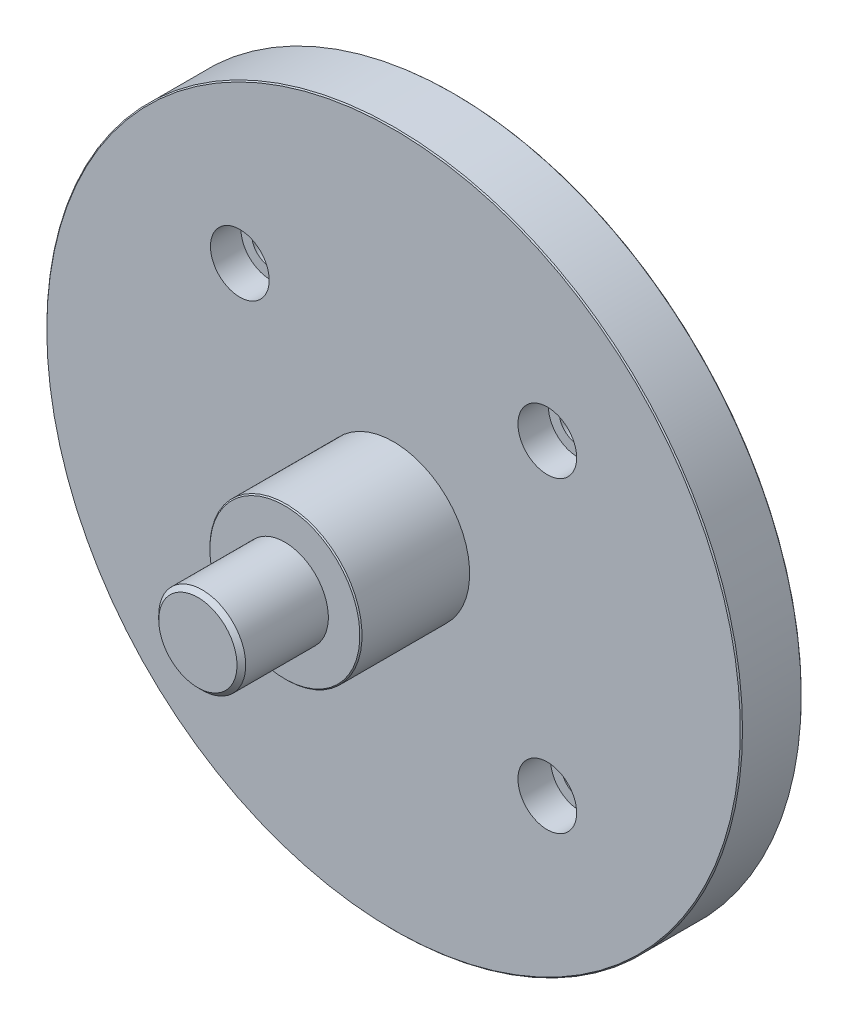
ISO-10303-21;
HEADER;
FILE_DESCRIPTION(('STEP AP214'),'2;1');
FILE_NAME('part.step','',(''),(''),'','','');
FILE_SCHEMA(('AUTOMOTIVE_DESIGN { 1 0 10303 214 1 1 1 1 }'));
ENDSEC;
DATA;
#1=APPLICATION_CONTEXT('core data for automotive mechanical design processes');
#2=APPLICATION_PROTOCOL_DEFINITION('international standard','automotive_design',2000,#1);
#3=PRODUCT_CONTEXT('',#1,'mechanical');
#4=PRODUCT('Part','Part','',(#3));
#5=PRODUCT_RELATED_PRODUCT_CATEGORY('part','',(#4));
#6=PRODUCT_DEFINITION_FORMATION('','',#4);
#7=PRODUCT_DEFINITION_CONTEXT('part definition',#1,'design');
#8=PRODUCT_DEFINITION('design','',#6,#7);
#9=PRODUCT_DEFINITION_SHAPE('','',#8);
#10=(LENGTH_UNIT() NAMED_UNIT(*) SI_UNIT(.MILLI.,.METRE.));
#11=(NAMED_UNIT(*) PLANE_ANGLE_UNIT() SI_UNIT($,.RADIAN.));
#12=(NAMED_UNIT(*) SI_UNIT($,.STERADIAN.) SOLID_ANGLE_UNIT());
#13=UNCERTAINTY_MEASURE_WITH_UNIT(LENGTH_MEASURE(1.E-05),#10,'distance_accuracy_value','');
#14=(GEOMETRIC_REPRESENTATION_CONTEXT(3) GLOBAL_UNCERTAINTY_ASSIGNED_CONTEXT((#13)) GLOBAL_UNIT_ASSIGNED_CONTEXT((#10,
#11,#12)) REPRESENTATION_CONTEXT('',''));
#15=CARTESIAN_POINT('',(0.,0.,0.));
#16=DIRECTION('',(0.,0.,1.));
#17=DIRECTION('',(1.,0.,0.));
#18=AXIS2_PLACEMENT_3D('',#15,#16,#17);
#19=CARTESIAN_POINT('',(-196.682719320138,-420.602297752566,-777.986147986319));
#20=DIRECTION('',(0.,0.,1.));
#21=DIRECTION('',(1.,0.,0.));
#22=AXIS2_PLACEMENT_3D('',#19,#20,#21);
#23=PLANE('',#22);
#24=CARTESIAN_POINT('',(-196.682719320138,-420.602297752566,-777.986147986319));
#25=DIRECTION('',(0.,0.,-1.));
#26=DIRECTION('',(-1.,0.,0.));
#27=AXIS2_PLACEMENT_3D('',#24,#25,#26);
#28=CIRCLE('',#27,9.00000000000001);
#29=CARTESIAN_POINT('',(-205.682719320138,-420.602297752566,-777.986147986319));
#30=VERTEX_POINT('',#29);
#31=EDGE_CURVE('E18',#30,#30,#28,.T.);
#32=ORIENTED_EDGE('',*,*,#31,.F.);
#33=EDGE_LOOP('',(#32));
#34=FACE_BOUND('',#33,.T.);
#35=ADVANCED_FACE('F15',(#34),#23,.T.);
#36=CARTESIAN_POINT('',(-196.682719320138,-420.602297752566,-778.986147986319));
#37=DIRECTION('',(0.,0.,-1.));
#38=DIRECTION('',(-1.,0.,0.));
#39=AXIS2_PLACEMENT_3D('',#36,#37,#38);
#40=CONICAL_SURFACE('',#39,10.,0.785398163397448);
#41=CARTESIAN_POINT('',(-196.682719320138,-420.602297752566,-778.986147986319));
#42=DIRECTION('',(0.,0.,-1.));
#43=DIRECTION('',(-1.,0.,0.));
#44=AXIS2_PLACEMENT_3D('',#41,#42,#43);
#45=CIRCLE('',#44,10.);
#46=CARTESIAN_POINT('',(-206.682719320138,-420.602297752566,-778.986147986319));
#47=VERTEX_POINT('',#46);
#48=EDGE_CURVE('E30',#47,#47,#45,.T.);
#49=ORIENTED_EDGE('',*,*,#48,.F.);
#50=EDGE_LOOP('',(#49));
#51=FACE_BOUND('',#50,.T.);
#52=ORIENTED_EDGE('',*,*,#31,.T.);
#53=EDGE_LOOP('',(#52));
#54=FACE_BOUND('',#53,.T.);
#55=ADVANCED_FACE('F105',(#51,#54),#40,.T.);
#56=CARTESIAN_POINT('',(-196.682719320138,-420.602297752566,-777.986147986319));
#57=DIRECTION('',(0.,0.,-1.));
#58=DIRECTION('',(-1.,0.,0.));
#59=AXIS2_PLACEMENT_3D('',#56,#57,#58);
#60=CYLINDRICAL_SURFACE('',#59,10.);
#61=ORIENTED_EDGE('',*,*,#48,.T.);
#62=EDGE_LOOP('',(#61));
#63=FACE_BOUND('',#62,.T.);
#64=CARTESIAN_POINT('',(-196.682719320138,-420.602297752566,-797.986147986318));
#65=DIRECTION('',(0.,0.,-1.));
#66=DIRECTION('',(-1.,0.,0.));
#67=AXIS2_PLACEMENT_3D('',#64,#65,#66);
#68=CIRCLE('',#67,10.);
#69=CARTESIAN_POINT('',(-206.682719320138,-420.602297752566,-797.986147986318));
#70=VERTEX_POINT('',#69);
#71=EDGE_CURVE('E95',#70,#70,#68,.T.);
#72=ORIENTED_EDGE('',*,*,#71,.F.);
#73=EDGE_LOOP('',(#72));
#74=FACE_BOUND('',#73,.T.);
#75=ADVANCED_FACE('F112',(#63,#74),#60,.T.);
#76=CARTESIAN_POINT('',(-196.682719320137,-420.602297752566,-797.986147986318));
#77=DIRECTION('',(0.,0.,1.));
#78=DIRECTION('',(1.,0.,0.));
#79=AXIS2_PLACEMENT_3D('',#76,#77,#78);
#80=PLANE('',#79);
#81=ORIENTED_EDGE('',*,*,#71,.T.);
#82=EDGE_LOOP('',(#81));
#83=FACE_BOUND('',#82,.T.);
#84=CARTESIAN_POINT('',(-196.682719320137,-420.602297752566,-797.986147986318));
#85=DIRECTION('',(0.,0.,-1.));
#86=DIRECTION('',(-1.,0.,0.));
#87=AXIS2_PLACEMENT_3D('',#84,#85,#86);
#88=CIRCLE('',#87,17.25);
#89=CARTESIAN_POINT('',(-213.932719320137,-420.602297752566,-797.986147986318));
#90=VERTEX_POINT('',#89);
#91=EDGE_CURVE('E93',#90,#90,#88,.T.);
#92=ORIENTED_EDGE('',*,*,#91,.F.);
#93=EDGE_LOOP('',(#92));
#94=FACE_BOUND('',#93,.T.);
#95=ADVANCED_FACE('F204',(#83,#94),#80,.T.);
#96=CARTESIAN_POINT('',(-196.682719320137,-420.602297752566,-798.236147986318));
#97=DIRECTION('',(0.,0.,-1.));
#98=DIRECTION('',(-1.,0.,0.));
#99=AXIS2_PLACEMENT_3D('',#96,#97,#98);
#100=CONICAL_SURFACE('',#99,17.5000000000005,0.785398163397448);
#101=ORIENTED_EDGE('',*,*,#91,.T.);
#102=EDGE_LOOP('',(#101));
#103=FACE_BOUND('',#102,.T.);
#104=CARTESIAN_POINT('',(-196.682719320137,-420.602297752566,-798.236147986318));
#105=DIRECTION('',(0.,0.,-1.));
#106=DIRECTION('',(-1.,0.,0.));
#107=AXIS2_PLACEMENT_3D('',#104,#105,#106);
#108=CIRCLE('',#107,17.5);
#109=CARTESIAN_POINT('',(-214.182719320137,-420.602297752566,-798.236147986318));
#110=VERTEX_POINT('',#109);
#111=EDGE_CURVE('E92',#110,#110,#108,.T.);
#112=ORIENTED_EDGE('',*,*,#111,.F.);
#113=EDGE_LOOP('',(#112));
#114=FACE_BOUND('',#113,.T.);
#115=ADVANCED_FACE('F200',(#103,#114),#100,.T.);
#116=CARTESIAN_POINT('',(-196.682719320137,-420.602297752566,-797.986147986318));
#117=DIRECTION('',(0.,0.,-1.));
#118=DIRECTION('',(-1.,0.,0.));
#119=AXIS2_PLACEMENT_3D('',#116,#117,#118);
#120=CYLINDRICAL_SURFACE('',#119,17.5);
#121=CARTESIAN_POINT('',(-196.682719320137,-420.602297752566,-822.98614798632));
#122=DIRECTION('',(0.,0.,-1.));
#123=DIRECTION('',(-1.,0.,0.));
#124=AXIS2_PLACEMENT_3D('',#121,#122,#123);
#125=CIRCLE('',#124,17.5);
#126=CARTESIAN_POINT('',(-214.182719320137,-420.602297752566,-822.98614798632));
#127=VERTEX_POINT('',#126);
#128=EDGE_CURVE('E89',#127,#127,#125,.T.);
#129=ORIENTED_EDGE('',*,*,#128,.F.);
#130=EDGE_LOOP('',(#129));
#131=FACE_BOUND('',#130,.T.);
#132=ORIENTED_EDGE('',*,*,#111,.T.);
#133=EDGE_LOOP('',(#132));
#134=FACE_BOUND('',#133,.T.);
#135=ADVANCED_FACE('F196',(#131,#134),#120,.T.);
#136=CARTESIAN_POINT('',(-196.682719320137,-420.602297752566,-822.98614798632));
#137=DIRECTION('',(0.,0.,1.));
#138=DIRECTION('',(1.,0.,0.));
#139=AXIS2_PLACEMENT_3D('',#136,#137,#138);
#140=PLANE('',#139);
#141=ORIENTED_EDGE('',*,*,#128,.T.);
#142=EDGE_LOOP('',(#141));
#143=FACE_BOUND('',#142,.T.);
#144=CARTESIAN_POINT('',(-232.037987668784,-455.957566101215,-822.98614798632));
#145=DIRECTION('',(0.,0.,-1.));
#146=DIRECTION('',(-1.,0.,0.));
#147=AXIS2_PLACEMENT_3D('',#144,#145,#146);
#148=CIRCLE('',#147,6.75);
#149=CARTESIAN_POINT('',(-238.787987668784,-455.957566101215,-822.98614798632));
#150=VERTEX_POINT('',#149);
#151=EDGE_CURVE('E74',#150,#150,#148,.T.);
#152=ORIENTED_EDGE('',*,*,#151,.T.);
#153=EDGE_LOOP('',(#152));
#154=FACE_BOUND('',#153,.T.);
#155=CARTESIAN_POINT('',(-161.327450971485,-455.957566101213,-822.98614798632));
#156=DIRECTION('',(0.,0.,-1.));
#157=DIRECTION('',(-1.,0.,0.));
#158=AXIS2_PLACEMENT_3D('',#155,#156,#157);
#159=CIRCLE('',#158,6.75);
#160=CARTESIAN_POINT('',(-168.077450971485,-455.957566101213,-822.98614798632));
#161=VERTEX_POINT('',#160);
#162=EDGE_CURVE('E77',#161,#161,#159,.T.);
#163=ORIENTED_EDGE('',*,*,#162,.T.);
#164=EDGE_LOOP('',(#163));
#165=FACE_BOUND('',#164,.T.);
#166=CARTESIAN_POINT('',(-161.327450971485,-385.247029403915,-822.98614798632));
#167=DIRECTION('',(0.,0.,-1.));
#168=DIRECTION('',(-1.,0.,0.));
#169=AXIS2_PLACEMENT_3D('',#166,#167,#168);
#170=CIRCLE('',#169,6.75);
#171=CARTESIAN_POINT('',(-168.077450971485,-385.247029403915,-822.98614798632));
#172=VERTEX_POINT('',#171);
#173=EDGE_CURVE('E80',#172,#172,#170,.T.);
#174=ORIENTED_EDGE('',*,*,#173,.T.);
#175=EDGE_LOOP('',(#174));
#176=FACE_BOUND('',#175,.T.);
#177=CARTESIAN_POINT('',(-232.037987668783,-385.247029403918,-822.98614798632));
#178=DIRECTION('',(0.,0.,-1.));
#179=DIRECTION('',(-1.,0.,0.));
#180=AXIS2_PLACEMENT_3D('',#177,#178,#179);
#181=CIRCLE('',#180,6.75);
#182=CARTESIAN_POINT('',(-238.787987668783,-385.247029403918,-822.98614798632));
#183=VERTEX_POINT('',#182);
#184=EDGE_CURVE('E83',#183,#183,#181,.T.);
#185=ORIENTED_EDGE('',*,*,#184,.T.);
#186=EDGE_LOOP('',(#185));
#187=FACE_BOUND('',#186,.T.);
#188=CARTESIAN_POINT('',(-196.682719320137,-420.602297752566,-822.986147986319));
#189=DIRECTION('',(0.,0.,-1.));
#190=DIRECTION('',(-1.,0.,0.));
#191=AXIS2_PLACEMENT_3D('',#188,#189,#190);
#192=CIRCLE('',#191,79.7500000000001);
#193=CARTESIAN_POINT('',(-276.432719320137,-420.602297752566,-822.986147986319));
#194=VERTEX_POINT('',#193);
#195=EDGE_CURVE('E86',#194,#194,#192,.T.);
#196=ORIENTED_EDGE('',*,*,#195,.F.);
#197=EDGE_LOOP('',(#196));
#198=FACE_BOUND('',#197,.T.);
#199=ADVANCED_FACE('F192',(#143,#154,#165,#176,#187,#198),#140,.T.);
#200=CARTESIAN_POINT('',(-196.682719320137,-420.602297752566,-823.236147986319));
#201=DIRECTION('',(0.,0.,-1.));
#202=DIRECTION('',(-1.,0.,0.));
#203=AXIS2_PLACEMENT_3D('',#200,#201,#202);
#204=CONICAL_SURFACE('',#203,79.9999999999996,0.785398163397448);
#205=ORIENTED_EDGE('',*,*,#195,.T.);
#206=EDGE_LOOP('',(#205));
#207=FACE_BOUND('',#206,.T.);
#208=CARTESIAN_POINT('',(-196.682719320137,-420.602297752566,-823.236147986319));
#209=DIRECTION('',(0.,0.,1.));
#210=DIRECTION('',(1.,0.,0.));
#211=AXIS2_PLACEMENT_3D('',#208,#209,#210);
#212=CIRCLE('',#211,80.);
#213=CARTESIAN_POINT('',(-116.682719320137,-420.602297752566,-823.236147986319));
#214=VERTEX_POINT('',#213);
#215=EDGE_CURVE('E73',#214,#214,#212,.F.);
#216=ORIENTED_EDGE('',*,*,#215,.F.);
#217=EDGE_LOOP('',(#216));
#218=FACE_BOUND('',#217,.T.);
#219=ADVANCED_FACE('F188',(#207,#218),#204,.T.);
#220=CARTESIAN_POINT('',(-232.037987668783,-385.247029403918,-826.486147986318));
#221=DIRECTION('',(0.,0.,-1.));
#222=DIRECTION('',(-1.,0.,0.));
#223=AXIS2_PLACEMENT_3D('',#220,#221,#222);
#224=CYLINDRICAL_SURFACE('',#223,6.75);
#225=ORIENTED_EDGE('',*,*,#184,.F.);
#226=EDGE_LOOP('',(#225));
#227=FACE_BOUND('',#226,.T.);
#228=CARTESIAN_POINT('',(-232.037987668783,-385.247029403918,-829.98614798632));
#229=DIRECTION('',(0.,0.,-1.));
#230=DIRECTION('',(-1.,0.,0.));
#231=AXIS2_PLACEMENT_3D('',#228,#229,#230);
#232=CIRCLE('',#231,6.75);
#233=CARTESIAN_POINT('',(-238.787987668783,-385.247029403918,-829.98614798632));
#234=VERTEX_POINT('',#233);
#235=EDGE_CURVE('E70',#234,#234,#232,.T.);
#236=ORIENTED_EDGE('',*,*,#235,.T.);
#237=EDGE_LOOP('',(#236));
#238=FACE_BOUND('',#237,.T.);
#239=ADVANCED_FACE('F184',(#227,#238),#224,.F.);
#240=CARTESIAN_POINT('',(-161.327450971485,-385.247029403915,-826.486147986318));
#241=DIRECTION('',(0.,0.,-1.));
#242=DIRECTION('',(-1.,0.,0.));
#243=AXIS2_PLACEMENT_3D('',#240,#241,#242);
#244=CYLINDRICAL_SURFACE('',#243,6.75);
#245=ORIENTED_EDGE('',*,*,#173,.F.);
#246=EDGE_LOOP('',(#245));
#247=FACE_BOUND('',#246,.T.);
#248=CARTESIAN_POINT('',(-161.327450971485,-385.247029403915,-829.98614798632));
#249=DIRECTION('',(0.,0.,-1.));
#250=DIRECTION('',(-1.,0.,0.));
#251=AXIS2_PLACEMENT_3D('',#248,#249,#250);
#252=CIRCLE('',#251,6.75);
#253=CARTESIAN_POINT('',(-168.077450971485,-385.247029403915,-829.98614798632));
#254=VERTEX_POINT('',#253);
#255=EDGE_CURVE('E67',#254,#254,#252,.T.);
#256=ORIENTED_EDGE('',*,*,#255,.T.);
#257=EDGE_LOOP('',(#256));
#258=FACE_BOUND('',#257,.T.);
#259=ADVANCED_FACE('F180',(#247,#258),#244,.F.);
#260=CARTESIAN_POINT('',(-161.327450971485,-455.957566101213,-826.73614798632));
#261=DIRECTION('',(0.,0.,-1.));
#262=DIRECTION('',(-1.,0.,0.));
#263=AXIS2_PLACEMENT_3D('',#260,#261,#262);
#264=CYLINDRICAL_SURFACE('',#263,6.75);
#265=ORIENTED_EDGE('',*,*,#162,.F.);
#266=EDGE_LOOP('',(#265));
#267=FACE_BOUND('',#266,.T.);
#268=CARTESIAN_POINT('',(-161.327450971485,-455.957566101213,-830.486147986317));
#269=DIRECTION('',(0.,0.,-1.));
#270=DIRECTION('',(-1.,0.,0.));
#271=AXIS2_PLACEMENT_3D('',#268,#269,#270);
#272=CIRCLE('',#271,6.75);
#273=CARTESIAN_POINT('',(-168.077450971485,-455.957566101213,-830.486147986317));
#274=VERTEX_POINT('',#273);
#275=EDGE_CURVE('E64',#274,#274,#272,.T.);
#276=ORIENTED_EDGE('',*,*,#275,.T.);
#277=EDGE_LOOP('',(#276));
#278=FACE_BOUND('',#277,.T.);
#279=ADVANCED_FACE('F176',(#267,#278),#264,.F.);
#280=CARTESIAN_POINT('',(-232.037987668784,-455.957566101215,-826.486147986318));
#281=DIRECTION('',(0.,0.,-1.));
#282=DIRECTION('',(-1.,0.,0.));
#283=AXIS2_PLACEMENT_3D('',#280,#281,#282);
#284=CYLINDRICAL_SURFACE('',#283,6.75);
#285=ORIENTED_EDGE('',*,*,#151,.F.);
#286=EDGE_LOOP('',(#285));
#287=FACE_BOUND('',#286,.T.);
#288=CARTESIAN_POINT('',(-232.037987668784,-455.957566101215,-829.98614798632));
#289=DIRECTION('',(0.,0.,-1.));
#290=DIRECTION('',(-1.,0.,0.));
#291=AXIS2_PLACEMENT_3D('',#288,#289,#290);
#292=CIRCLE('',#291,6.75);
#293=CARTESIAN_POINT('',(-238.787987668784,-455.957566101215,-829.98614798632));
#294=VERTEX_POINT('',#293);
#295=EDGE_CURVE('E61',#294,#294,#292,.T.);
#296=ORIENTED_EDGE('',*,*,#295,.T.);
#297=EDGE_LOOP('',(#296));
#298=FACE_BOUND('',#297,.T.);
#299=ADVANCED_FACE('F172',(#287,#298),#284,.F.);
#300=CARTESIAN_POINT('',(-196.682719320137,-420.602297752566,-856.986147986318));
#301=DIRECTION('',(0.,0.,-1.));
#302=DIRECTION('',(-1.,0.,0.));
#303=AXIS2_PLACEMENT_3D('',#300,#301,#302);
#304=PLANE('',#303);
#305=CARTESIAN_POINT('',(-196.682719320137,-420.602297752566,-856.986147986318));
#306=DIRECTION('',(0.,0.,1.));
#307=DIRECTION('',(1.,0.,0.));
#308=AXIS2_PLACEMENT_3D('',#305,#306,#307);
#309=CIRCLE('',#308,19.75);
#310=CARTESIAN_POINT('',(-176.932719320137,-420.602297752566,-856.986147986318));
#311=VERTEX_POINT('',#310);
#312=EDGE_CURVE('E58',#311,#311,#309,.T.);
#313=ORIENTED_EDGE('',*,*,#312,.F.);
#314=EDGE_LOOP('',(#313));
#315=FACE_BOUND('',#314,.T.);
#316=ADVANCED_FACE('F168',(#315),#304,.T.);
#317=CARTESIAN_POINT('',(-196.682719320137,-420.602297752566,-829.98614798632));
#318=DIRECTION('',(0.,0.,1.));
#319=DIRECTION('',(1.,0.,0.));
#320=AXIS2_PLACEMENT_3D('',#317,#318,#319);
#321=CYLINDRICAL_SURFACE('',#320,80.);
#322=CARTESIAN_POINT('',(-196.682719320137,-420.602297752566,-836.736147986319));
#323=DIRECTION('',(0.,0.,1.));
#324=DIRECTION('',(-1.,0.,0.));
#325=AXIS2_PLACEMENT_3D('',#322,#323,#324);
#326=CIRCLE('',#325,80.);
#327=CARTESIAN_POINT('',(-276.682719320137,-420.602297752566,-836.736147986319));
#328=VERTEX_POINT('',#327);
#329=EDGE_CURVE('E57',#328,#328,#326,.F.);
#330=ORIENTED_EDGE('',*,*,#329,.F.);
#331=EDGE_LOOP('',(#330));
#332=FACE_BOUND('',#331,.T.);
#333=ORIENTED_EDGE('',*,*,#215,.T.);
#334=EDGE_LOOP('',(#333));
#335=FACE_BOUND('',#334,.T.);
#336=ADVANCED_FACE('F164',(#332,#335),#321,.T.);
#337=CARTESIAN_POINT('',(-232.037987668783,-385.247029403918,-829.98614798632));
#338=DIRECTION('',(0.,0.,-1.));
#339=DIRECTION('',(-1.,0.,0.));
#340=AXIS2_PLACEMENT_3D('',#337,#338,#339);
#341=PLANE('',#340);
#342=CARTESIAN_POINT('',(-232.037987668783,-385.247029403918,-829.98614798632));
#343=DIRECTION('',(0.,0.,-1.));
#344=DIRECTION('',(-1.,0.,0.));
#345=AXIS2_PLACEMENT_3D('',#342,#343,#344);
#346=CIRCLE('',#345,4.24999999999999);
#347=CARTESIAN_POINT('',(-236.287987668783,-385.247029403918,-829.98614798632));
#348=VERTEX_POINT('',#347);
#349=EDGE_CURVE('E54',#348,#348,#346,.T.);
#350=ORIENTED_EDGE('',*,*,#349,.T.);
#351=EDGE_LOOP('',(#350));
#352=FACE_BOUND('',#351,.T.);
#353=ORIENTED_EDGE('',*,*,#235,.F.);
#354=EDGE_LOOP('',(#353));
#355=FACE_BOUND('',#354,.T.);
#356=ADVANCED_FACE('F160',(#352,#355),#341,.F.);
#357=CARTESIAN_POINT('',(-161.327450971485,-385.247029403915,-829.98614798632));
#358=DIRECTION('',(0.,0.,-1.));
#359=DIRECTION('',(-1.,0.,0.));
#360=AXIS2_PLACEMENT_3D('',#357,#358,#359);
#361=PLANE('',#360);
#362=CARTESIAN_POINT('',(-161.327450971485,-385.247029403915,-829.98614798632));
#363=DIRECTION('',(0.,0.,-1.));
#364=DIRECTION('',(-1.,0.,0.));
#365=AXIS2_PLACEMENT_3D('',#362,#363,#364);
#366=CIRCLE('',#365,4.24999999999999);
#367=CARTESIAN_POINT('',(-165.577450971485,-385.247029403915,-829.98614798632));
#368=VERTEX_POINT('',#367);
#369=EDGE_CURVE('E51',#368,#368,#366,.T.);
#370=ORIENTED_EDGE('',*,*,#369,.T.);
#371=EDGE_LOOP('',(#370));
#372=FACE_BOUND('',#371,.T.);
#373=ORIENTED_EDGE('',*,*,#255,.F.);
#374=EDGE_LOOP('',(#373));
#375=FACE_BOUND('',#374,.T.);
#376=ADVANCED_FACE('F156',(#372,#375),#361,.F.);
#377=CARTESIAN_POINT('',(-161.327450971485,-455.957566101213,-830.486147986317));
#378=DIRECTION('',(0.,0.,-1.));
#379=DIRECTION('',(-1.,0.,0.));
#380=AXIS2_PLACEMENT_3D('',#377,#378,#379);
#381=PLANE('',#380);
#382=CARTESIAN_POINT('',(-161.327450971485,-455.957566101213,-830.486147986317));
#383=DIRECTION('',(0.,0.,-1.));
#384=DIRECTION('',(-1.,0.,0.));
#385=AXIS2_PLACEMENT_3D('',#382,#383,#384);
#386=CIRCLE('',#385,4.24999999999999);
#387=CARTESIAN_POINT('',(-165.577450971485,-455.957566101213,-830.486147986317));
#388=VERTEX_POINT('',#387);
#389=EDGE_CURVE('E48',#388,#388,#386,.T.);
#390=ORIENTED_EDGE('',*,*,#389,.T.);
#391=EDGE_LOOP('',(#390));
#392=FACE_BOUND('',#391,.T.);
#393=ORIENTED_EDGE('',*,*,#275,.F.);
#394=EDGE_LOOP('',(#393));
#395=FACE_BOUND('',#394,.T.);
#396=ADVANCED_FACE('F152',(#392,#395),#381,.F.);
#397=CARTESIAN_POINT('',(-232.037987668784,-455.957566101215,-829.98614798632));
#398=DIRECTION('',(0.,0.,-1.));
#399=DIRECTION('',(-1.,0.,0.));
#400=AXIS2_PLACEMENT_3D('',#397,#398,#399);
#401=PLANE('',#400);
#402=CARTESIAN_POINT('',(-232.037987668784,-455.957566101215,-829.98614798632));
#403=DIRECTION('',(0.,0.,-1.));
#404=DIRECTION('',(-1.,0.,0.));
#405=AXIS2_PLACEMENT_3D('',#402,#403,#404);
#406=CIRCLE('',#405,4.24999999999999);
#407=CARTESIAN_POINT('',(-236.287987668784,-455.957566101215,-829.98614798632));
#408=VERTEX_POINT('',#407);
#409=EDGE_CURVE('E45',#408,#408,#406,.T.);
#410=ORIENTED_EDGE('',*,*,#409,.T.);
#411=EDGE_LOOP('',(#410));
#412=FACE_BOUND('',#411,.T.);
#413=ORIENTED_EDGE('',*,*,#295,.F.);
#414=EDGE_LOOP('',(#413));
#415=FACE_BOUND('',#414,.T.);
#416=ADVANCED_FACE('F148',(#412,#415),#401,.F.);
#417=CARTESIAN_POINT('',(-196.682719320137,-420.602297752566,-856.736147986318));
#418=DIRECTION('',(0.,0.,1.));
#419=DIRECTION('',(1.,0.,0.));
#420=AXIS2_PLACEMENT_3D('',#417,#418,#419);
#421=CONICAL_SURFACE('',#420,19.9999999999995,0.785398163397448);
#422=ORIENTED_EDGE('',*,*,#312,.T.);
#423=EDGE_LOOP('',(#422));
#424=FACE_BOUND('',#423,.T.);
#425=CARTESIAN_POINT('',(-196.682719320137,-420.602297752566,-856.736147986318));
#426=DIRECTION('',(0.,0.,1.));
#427=DIRECTION('',(1.,0.,0.));
#428=AXIS2_PLACEMENT_3D('',#425,#426,#427);
#429=CIRCLE('',#428,20.);
#430=CARTESIAN_POINT('',(-176.682719320137,-420.602297752566,-856.736147986318));
#431=VERTEX_POINT('',#430);
#432=EDGE_CURVE('E44',#431,#431,#429,.T.);
#433=ORIENTED_EDGE('',*,*,#432,.F.);
#434=EDGE_LOOP('',(#433));
#435=FACE_BOUND('',#434,.T.);
#436=ADVANCED_FACE('F144',(#424,#435),#421,.T.);
#437=CARTESIAN_POINT('',(-196.682719320137,-420.602297752566,-836.736147986319));
#438=DIRECTION('',(0.,0.,1.));
#439=DIRECTION('',(1.,0.,0.));
#440=AXIS2_PLACEMENT_3D('',#437,#438,#439);
#441=CONICAL_SURFACE('',#440,80.,0.785398163397448);
#442=CARTESIAN_POINT('',(-196.682719320137,-420.602297752566,-836.98614798632));
#443=DIRECTION('',(0.,0.,1.));
#444=DIRECTION('',(0.,-1.,0.));
#445=AXIS2_PLACEMENT_3D('',#442,#443,#444);
#446=CIRCLE('',#445,79.7499999999995);
#447=CARTESIAN_POINT('',(-196.682719320137,-500.352297752566,-836.98614798632));
#448=VERTEX_POINT('',#447);
#449=EDGE_CURVE('E41',#448,#448,#446,.F.);
#450=ORIENTED_EDGE('',*,*,#449,.F.);
#451=EDGE_LOOP('',(#450));
#452=FACE_BOUND('',#451,.T.);
#453=ORIENTED_EDGE('',*,*,#329,.T.);
#454=EDGE_LOOP('',(#453));
#455=FACE_BOUND('',#454,.T.);
#456=ADVANCED_FACE('F140',(#452,#455),#441,.T.);
#457=CARTESIAN_POINT('',(-232.037987668783,-385.247029403918,-822.98614798632));
#458=DIRECTION('',(0.,0.,-1.));
#459=DIRECTION('',(-1.,0.,0.));
#460=AXIS2_PLACEMENT_3D('',#457,#458,#459);
#461=CYLINDRICAL_SURFACE('',#460,4.24999999999999);
#462=CARTESIAN_POINT('',(-232.037987668783,-385.247029403918,-836.986147986319));
#463=DIRECTION('',(0.,0.,-1.));
#464=DIRECTION('',(-1.,0.,0.));
#465=AXIS2_PLACEMENT_3D('',#462,#463,#464);
#466=CIRCLE('',#465,4.24999999999999);
#467=CARTESIAN_POINT('',(-236.287987668783,-385.247029403918,-836.986147986319));
#468=VERTEX_POINT('',#467);
#469=EDGE_CURVE('E38',#468,#468,#466,.F.);
#470=ORIENTED_EDGE('',*,*,#469,.F.);
#471=EDGE_LOOP('',(#470));
#472=FACE_BOUND('',#471,.T.);
#473=ORIENTED_EDGE('',*,*,#349,.F.);
#474=EDGE_LOOP('',(#473));
#475=FACE_BOUND('',#474,.T.);
#476=ADVANCED_FACE('F136',(#472,#475),#461,.F.);
#477=CARTESIAN_POINT('',(-161.327450971485,-385.247029403915,-822.98614798632));
#478=DIRECTION('',(0.,0.,-1.));
#479=DIRECTION('',(-1.,0.,0.));
#480=AXIS2_PLACEMENT_3D('',#477,#478,#479);
#481=CYLINDRICAL_SURFACE('',#480,4.24999999999999);
#482=CARTESIAN_POINT('',(-161.327450971485,-385.247029403915,-836.986147986319));
#483=DIRECTION('',(0.,0.,-1.));
#484=DIRECTION('',(-1.,0.,0.));
#485=AXIS2_PLACEMENT_3D('',#482,#483,#484);
#486=CIRCLE('',#485,4.24999999999999);
#487=CARTESIAN_POINT('',(-165.577450971485,-385.247029403915,-836.986147986319));
#488=VERTEX_POINT('',#487);
#489=EDGE_CURVE('E35',#488,#488,#486,.F.);
#490=ORIENTED_EDGE('',*,*,#489,.F.);
#491=EDGE_LOOP('',(#490));
#492=FACE_BOUND('',#491,.T.);
#493=ORIENTED_EDGE('',*,*,#369,.F.);
#494=EDGE_LOOP('',(#493));
#495=FACE_BOUND('',#494,.T.);
#496=ADVANCED_FACE('F132',(#492,#495),#481,.F.);
#497=CARTESIAN_POINT('',(-161.327450971485,-455.957566101213,-822.98614798632));
#498=DIRECTION('',(0.,0.,-1.));
#499=DIRECTION('',(-1.,0.,0.));
#500=AXIS2_PLACEMENT_3D('',#497,#498,#499);
#501=CYLINDRICAL_SURFACE('',#500,4.24999999999999);
#502=ORIENTED_EDGE('',*,*,#389,.F.);
#503=EDGE_LOOP('',(#502));
#504=FACE_BOUND('',#503,.T.);
#505=CARTESIAN_POINT('',(-161.327450971485,-455.957566101213,-836.986147986319));
#506=DIRECTION('',(0.,0.,-1.));
#507=DIRECTION('',(-1.,0.,0.));
#508=AXIS2_PLACEMENT_3D('',#505,#506,#507);
#509=CIRCLE('',#508,4.24999999999999);
#510=CARTESIAN_POINT('',(-165.577450971485,-455.957566101213,-836.986147986319));
#511=VERTEX_POINT('',#510);
#512=EDGE_CURVE('E27',#511,#511,#509,.F.);
#513=ORIENTED_EDGE('',*,*,#512,.F.);
#514=EDGE_LOOP('',(#513));
#515=FACE_BOUND('',#514,.T.);
#516=ADVANCED_FACE('F128',(#504,#515),#501,.F.);
#517=CARTESIAN_POINT('',(-232.037987668784,-455.957566101215,-822.98614798632));
#518=DIRECTION('',(0.,0.,-1.));
#519=DIRECTION('',(-1.,0.,0.));
#520=AXIS2_PLACEMENT_3D('',#517,#518,#519);
#521=CYLINDRICAL_SURFACE('',#520,4.24999999999999);
#522=ORIENTED_EDGE('',*,*,#409,.F.);
#523=EDGE_LOOP('',(#522));
#524=FACE_BOUND('',#523,.T.);
#525=CARTESIAN_POINT('',(-232.037987668784,-455.957566101215,-836.986147986319));
#526=DIRECTION('',(0.,0.,-1.));
#527=DIRECTION('',(-1.,0.,0.));
#528=AXIS2_PLACEMENT_3D('',#525,#526,#527);
#529=CIRCLE('',#528,4.24999999999999);
#530=CARTESIAN_POINT('',(-236.287987668784,-455.957566101215,-836.986147986319));
#531=VERTEX_POINT('',#530);
#532=EDGE_CURVE('E22',#531,#531,#529,.F.);
#533=ORIENTED_EDGE('',*,*,#532,.F.);
#534=EDGE_LOOP('',(#533));
#535=FACE_BOUND('',#534,.T.);
#536=ADVANCED_FACE('F121',(#524,#535),#521,.F.);
#537=CARTESIAN_POINT('',(-196.682719320137,-420.602297752566,-856.986147986318));
#538=DIRECTION('',(0.,0.,1.));
#539=DIRECTION('',(1.,0.,0.));
#540=AXIS2_PLACEMENT_3D('',#537,#538,#539);
#541=CYLINDRICAL_SURFACE('',#540,20.);
#542=CARTESIAN_POINT('',(-196.682719320137,-420.602297752566,-836.986147986319));
#543=DIRECTION('',(0.,0.,1.));
#544=DIRECTION('',(1.,0.,0.));
#545=AXIS2_PLACEMENT_3D('',#542,#543,#544);
#546=CIRCLE('',#545,20.);
#547=CARTESIAN_POINT('',(-176.682719320137,-420.602297752566,-836.986147986319));
#548=VERTEX_POINT('',#547);
#549=EDGE_CURVE('E10',#548,#548,#546,.T.);
#550=ORIENTED_EDGE('',*,*,#549,.F.);
#551=EDGE_LOOP('',(#550));
#552=FACE_BOUND('',#551,.T.);
#553=ORIENTED_EDGE('',*,*,#432,.T.);
#554=EDGE_LOOP('',(#553));
#555=FACE_BOUND('',#554,.T.);
#556=ADVANCED_FACE('F116',(#552,#555),#541,.T.);
#557=CARTESIAN_POINT('',(-196.682719320137,-420.602297752566,-836.986147986319));
#558=DIRECTION('',(0.,0.,-1.));
#559=DIRECTION('',(-1.,0.,0.));
#560=AXIS2_PLACEMENT_3D('',#557,#558,#559);
#561=PLANE('',#560);
#562=ORIENTED_EDGE('',*,*,#549,.T.);
#563=EDGE_LOOP('',(#562));
#564=FACE_BOUND('',#563,.T.);
#565=ORIENTED_EDGE('',*,*,#532,.T.);
#566=EDGE_LOOP('',(#565));
#567=FACE_BOUND('',#566,.T.);
#568=ORIENTED_EDGE('',*,*,#512,.T.);
#569=EDGE_LOOP('',(#568));
#570=FACE_BOUND('',#569,.T.);
#571=ORIENTED_EDGE('',*,*,#489,.T.);
#572=EDGE_LOOP('',(#571));
#573=FACE_BOUND('',#572,.T.);
#574=ORIENTED_EDGE('',*,*,#469,.T.);
#575=EDGE_LOOP('',(#574));
#576=FACE_BOUND('',#575,.T.);
#577=ORIENTED_EDGE('',*,*,#449,.T.);
#578=EDGE_LOOP('',(#577));
#579=FACE_BOUND('',#578,.T.);
#580=ADVANCED_FACE('F114',(#564,#567,#570,#573,#576,#579),#561,.T.);
#581=CLOSED_SHELL('',(#35,#55,#75,#95,#115,#135,#199,#219,#239,#259,#279,#299,#316,#336,#356,
#376,#396,#416,#436,#456,#476,#496,#516,#536,#556,#580));
#582=MANIFOLD_SOLID_BREP('B1',#581);
#583=ADVANCED_BREP_SHAPE_REPRESENTATION('',(#18,#582),#14);
#584=SHAPE_DEFINITION_REPRESENTATION(#9,#583);
ENDSEC;
END-ISO-10303-21;
